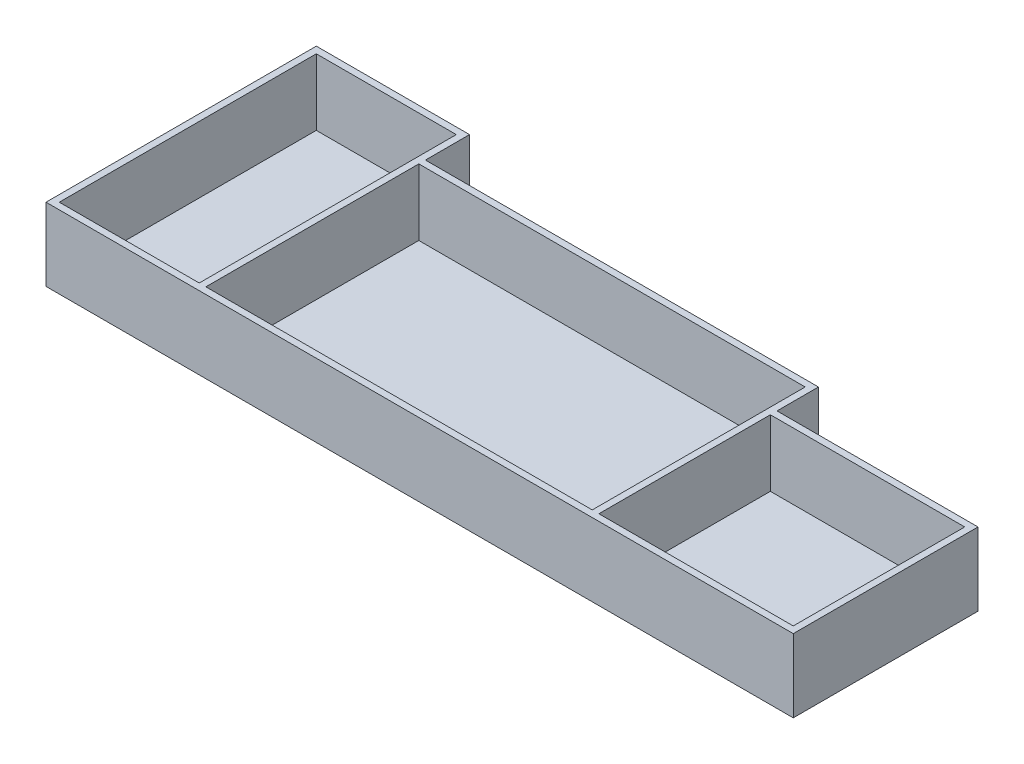
ISO-10303-21;
HEADER;
FILE_DESCRIPTION(('STEP AP214'),'2;1');
FILE_NAME('part.step','',(''),(''),'','','');
FILE_SCHEMA(('AUTOMOTIVE_DESIGN { 1 0 10303 214 1 1 1 1 }'));
ENDSEC;
DATA;
#1=APPLICATION_CONTEXT('core data for automotive mechanical design processes');
#2=APPLICATION_PROTOCOL_DEFINITION('international standard','automotive_design',2000,#1);
#3=PRODUCT_CONTEXT('',#1,'mechanical');
#4=PRODUCT('Part','Part','',(#3));
#5=PRODUCT_RELATED_PRODUCT_CATEGORY('part','',(#4));
#6=PRODUCT_DEFINITION_FORMATION('','',#4);
#7=PRODUCT_DEFINITION_CONTEXT('part definition',#1,'design');
#8=PRODUCT_DEFINITION('design','',#6,#7);
#9=PRODUCT_DEFINITION_SHAPE('','',#8);
#10=(LENGTH_UNIT() NAMED_UNIT(*) SI_UNIT(.MILLI.,.METRE.));
#11=(NAMED_UNIT(*) PLANE_ANGLE_UNIT() SI_UNIT($,.RADIAN.));
#12=(NAMED_UNIT(*) SI_UNIT($,.STERADIAN.) SOLID_ANGLE_UNIT());
#13=UNCERTAINTY_MEASURE_WITH_UNIT(LENGTH_MEASURE(1.E-05),#10,'distance_accuracy_value','');
#14=(GEOMETRIC_REPRESENTATION_CONTEXT(3) GLOBAL_UNCERTAINTY_ASSIGNED_CONTEXT((#13)) GLOBAL_UNIT_ASSIGNED_CONTEXT((#10,
#11,#12)) REPRESENTATION_CONTEXT('',''));
#15=CARTESIAN_POINT('',(0.,0.,0.));
#16=DIRECTION('',(0.,0.,1.));
#17=DIRECTION('',(1.,0.,0.));
#18=AXIS2_PLACEMENT_3D('',#15,#16,#17);
#19=CARTESIAN_POINT('',(0.,-2.,0.));
#20=DIRECTION('',(1.,0.,0.));
#21=DIRECTION('',(0.,0.,-1.));
#22=AXIS2_PLACEMENT_3D('',#19,#20,#21);
#23=PLANE('',#22);
#24=DIRECTION('',(0.,1.,0.));
#25=VECTOR('',#24,1.);
#26=CARTESIAN_POINT('',(0.,-2.,0.));
#27=LINE('',#26,#25);
#28=CARTESIAN_POINT('',(0.,-2.,0.));
#29=VERTEX_POINT('',#28);
#30=CARTESIAN_POINT('',(0.,20.,0.));
#31=VERTEX_POINT('',#30);
#32=EDGE_CURVE('E38',#29,#31,#27,.T.);
#33=ORIENTED_EDGE('',*,*,#32,.T.);
#34=DIRECTION('',(0.,0.,-1.));
#35=VECTOR('',#34,1.);
#36=CARTESIAN_POINT('',(0.,20.,0.));
#37=LINE('',#36,#35);
#38=CARTESIAN_POINT('',(0.,20.,-81.5));
#39=VERTEX_POINT('',#38);
#40=EDGE_CURVE('E175',#31,#39,#37,.T.);
#41=ORIENTED_EDGE('',*,*,#40,.T.);
#42=DIRECTION('',(0.,1.,0.));
#43=VECTOR('',#42,1.);
#44=CARTESIAN_POINT('',(0.,-2.,-81.5));
#45=LINE('',#44,#43);
#46=CARTESIAN_POINT('',(0.,-2.,-81.5));
#47=VERTEX_POINT('',#46);
#48=EDGE_CURVE('E11',#47,#39,#45,.T.);
#49=ORIENTED_EDGE('',*,*,#48,.F.);
#50=DIRECTION('',(0.,0.,-1.));
#51=VECTOR('',#50,1.);
#52=CARTESIAN_POINT('',(0.,-2.,0.));
#53=LINE('',#52,#51);
#54=EDGE_CURVE('E178',#29,#47,#53,.T.);
#55=ORIENTED_EDGE('',*,*,#54,.F.);
#56=EDGE_LOOP('',(#33,#41,#49,#55));
#57=FACE_BOUND('',#56,.T.);
#58=ADVANCED_FACE('F35',(#57),#23,.F.);
#59=CARTESIAN_POINT('',(0.,-2.,-81.5));
#60=DIRECTION('',(0.,0.,1.));
#61=DIRECTION('',(1.,0.,0.));
#62=AXIS2_PLACEMENT_3D('',#59,#60,#61);
#63=PLANE('',#62);
#64=ORIENTED_EDGE('',*,*,#48,.T.);
#65=DIRECTION('',(1.,0.,0.));
#66=VECTOR('',#65,1.);
#67=CARTESIAN_POINT('',(0.,20.,-81.5));
#68=LINE('',#67,#66);
#69=CARTESIAN_POINT('',(46.2,20.,-81.5));
#70=VERTEX_POINT('',#69);
#71=EDGE_CURVE('E197',#39,#70,#68,.T.);
#72=ORIENTED_EDGE('',*,*,#71,.T.);
#73=DIRECTION('',(0.,1.,0.));
#74=VECTOR('',#73,1.);
#75=CARTESIAN_POINT('',(46.2,-2.,-81.5));
#76=LINE('',#75,#74);
#77=CARTESIAN_POINT('',(46.2,-2.,-81.5));
#78=VERTEX_POINT('',#77);
#79=EDGE_CURVE('E43',#78,#70,#76,.T.);
#80=ORIENTED_EDGE('',*,*,#79,.F.);
#81=DIRECTION('',(1.,0.,0.));
#82=VECTOR('',#81,1.);
#83=CARTESIAN_POINT('',(0.,-2.,-81.5));
#84=LINE('',#83,#82);
#85=EDGE_CURVE('E183',#47,#78,#84,.T.);
#86=ORIENTED_EDGE('',*,*,#85,.F.);
#87=EDGE_LOOP('',(#64,#72,#80,#86));
#88=FACE_BOUND('',#87,.T.);
#89=ADVANCED_FACE('F348',(#88),#63,.F.);
#90=CARTESIAN_POINT('',(46.2,-2.,0.));
#91=DIRECTION('',(-1.,0.,0.));
#92=DIRECTION('',(0.,0.,1.));
#93=AXIS2_PLACEMENT_3D('',#90,#91,#92);
#94=PLANE('',#93);
#95=ORIENTED_EDGE('',*,*,#79,.T.);
#96=DIRECTION('',(0.,0.,1.));
#97=VECTOR('',#96,1.);
#98=CARTESIAN_POINT('',(46.2,20.,0.));
#99=LINE('',#98,#97);
#100=CARTESIAN_POINT('',(46.2,20.,-68.2));
#101=VERTEX_POINT('',#100);
#102=EDGE_CURVE('E213',#70,#101,#99,.T.);
#103=ORIENTED_EDGE('',*,*,#102,.T.);
#104=DIRECTION('',(0.,1.,0.));
#105=VECTOR('',#104,1.);
#106=CARTESIAN_POINT('',(46.2,-2.,-68.2));
#107=LINE('',#106,#105);
#108=CARTESIAN_POINT('',(46.2,-2.,-68.2));
#109=VERTEX_POINT('',#108);
#110=EDGE_CURVE('E317',#109,#101,#107,.T.);
#111=ORIENTED_EDGE('',*,*,#110,.F.);
#112=DIRECTION('',(0.,0.,1.));
#113=VECTOR('',#112,1.);
#114=CARTESIAN_POINT('',(46.2,-2.,0.));
#115=LINE('',#114,#113);
#116=EDGE_CURVE('E313',#78,#109,#115,.T.);
#117=ORIENTED_EDGE('',*,*,#116,.F.);
#118=EDGE_LOOP('',(#95,#103,#111,#117));
#119=FACE_BOUND('',#118,.T.);
#120=ADVANCED_FACE('F345',(#119),#94,.F.);
#121=CARTESIAN_POINT('',(0.,-2.,-68.2));
#122=DIRECTION('',(0.,0.,1.));
#123=DIRECTION('',(1.,0.,0.));
#124=AXIS2_PLACEMENT_3D('',#121,#122,#123);
#125=PLANE('',#124);
#126=ORIENTED_EDGE('',*,*,#110,.T.);
#127=DIRECTION('',(1.,0.,0.));
#128=VECTOR('',#127,1.);
#129=CARTESIAN_POINT('',(0.,20.,-68.2));
#130=LINE('',#129,#128);
#131=CARTESIAN_POINT('',(164.7,20.,-68.2));
#132=VERTEX_POINT('',#131);
#133=EDGE_CURVE('E210',#101,#132,#130,.T.);
#134=ORIENTED_EDGE('',*,*,#133,.T.);
#135=DIRECTION('',(0.,1.,0.));
#136=VECTOR('',#135,1.);
#137=CARTESIAN_POINT('',(164.7,-2.,-68.2));
#138=LINE('',#137,#136);
#139=CARTESIAN_POINT('',(164.7,-2.,-68.2));
#140=VERTEX_POINT('',#139);
#141=EDGE_CURVE('E319',#140,#132,#138,.T.);
#142=ORIENTED_EDGE('',*,*,#141,.F.);
#143=DIRECTION('',(1.,0.,0.));
#144=VECTOR('',#143,1.);
#145=CARTESIAN_POINT('',(0.,-2.,-68.2));
#146=LINE('',#145,#144);
#147=EDGE_CURVE('E311',#109,#140,#146,.T.);
#148=ORIENTED_EDGE('',*,*,#147,.F.);
#149=EDGE_LOOP('',(#126,#134,#142,#148));
#150=FACE_BOUND('',#149,.T.);
#151=ADVANCED_FACE('F340',(#150),#125,.F.);
#152=CARTESIAN_POINT('',(164.7,-2.,0.));
#153=DIRECTION('',(-1.,0.,0.));
#154=DIRECTION('',(0.,0.,1.));
#155=AXIS2_PLACEMENT_3D('',#152,#153,#154);
#156=PLANE('',#155);
#157=ORIENTED_EDGE('',*,*,#141,.T.);
#158=DIRECTION('',(0.,0.,1.));
#159=VECTOR('',#158,1.);
#160=CARTESIAN_POINT('',(164.7,20.,0.));
#161=LINE('',#160,#159);
#162=CARTESIAN_POINT('',(164.7,20.,-55.7));
#163=VERTEX_POINT('',#162);
#164=EDGE_CURVE('E207',#132,#163,#161,.T.);
#165=ORIENTED_EDGE('',*,*,#164,.T.);
#166=DIRECTION('',(0.,1.,0.));
#167=VECTOR('',#166,1.);
#168=CARTESIAN_POINT('',(164.7,-2.,-55.7));
#169=LINE('',#168,#167);
#170=CARTESIAN_POINT('',(164.7,-2.,-55.7));
#171=VERTEX_POINT('',#170);
#172=EDGE_CURVE('E321',#171,#163,#169,.T.);
#173=ORIENTED_EDGE('',*,*,#172,.F.);
#174=DIRECTION('',(0.,0.,1.));
#175=VECTOR('',#174,1.);
#176=CARTESIAN_POINT('',(164.7,-2.,0.));
#177=LINE('',#176,#175);
#178=EDGE_CURVE('E309',#140,#171,#177,.T.);
#179=ORIENTED_EDGE('',*,*,#178,.F.);
#180=EDGE_LOOP('',(#157,#165,#173,#179));
#181=FACE_BOUND('',#180,.T.);
#182=ADVANCED_FACE('F336',(#181),#156,.F.);
#183=CARTESIAN_POINT('',(0.,-2.,-55.7));
#184=DIRECTION('',(0.,0.,1.));
#185=DIRECTION('',(1.,0.,0.));
#186=AXIS2_PLACEMENT_3D('',#183,#184,#185);
#187=PLANE('',#186);
#188=ORIENTED_EDGE('',*,*,#172,.T.);
#189=DIRECTION('',(1.,0.,0.));
#190=VECTOR('',#189,1.);
#191=CARTESIAN_POINT('',(0.,20.,-55.7));
#192=LINE('',#191,#190);
#193=CARTESIAN_POINT('',(225.3,20.,-55.7));
#194=VERTEX_POINT('',#193);
#195=EDGE_CURVE('E204',#163,#194,#192,.T.);
#196=ORIENTED_EDGE('',*,*,#195,.T.);
#197=DIRECTION('',(0.,1.,0.));
#198=VECTOR('',#197,1.);
#199=CARTESIAN_POINT('',(225.3,-2.,-55.7));
#200=LINE('',#199,#198);
#201=CARTESIAN_POINT('',(225.3,-2.,-55.7));
#202=VERTEX_POINT('',#201);
#203=EDGE_CURVE('E323',#202,#194,#200,.T.);
#204=ORIENTED_EDGE('',*,*,#203,.F.);
#205=DIRECTION('',(1.,0.,0.));
#206=VECTOR('',#205,1.);
#207=CARTESIAN_POINT('',(0.,-2.,-55.7));
#208=LINE('',#207,#206);
#209=EDGE_CURVE('E307',#171,#202,#208,.T.);
#210=ORIENTED_EDGE('',*,*,#209,.F.);
#211=EDGE_LOOP('',(#188,#196,#204,#210));
#212=FACE_BOUND('',#211,.T.);
#213=ADVANCED_FACE('F332',(#212),#187,.F.);
#214=CARTESIAN_POINT('',(225.3,-2.,0.));
#215=DIRECTION('',(-1.,0.,0.));
#216=DIRECTION('',(0.,0.,1.));
#217=AXIS2_PLACEMENT_3D('',#214,#215,#216);
#218=PLANE('',#217);
#219=ORIENTED_EDGE('',*,*,#203,.T.);
#220=DIRECTION('',(0.,0.,1.));
#221=VECTOR('',#220,1.);
#222=CARTESIAN_POINT('',(225.3,20.,0.));
#223=LINE('',#222,#221);
#224=CARTESIAN_POINT('',(225.3,20.,0.));
#225=VERTEX_POINT('',#224);
#226=EDGE_CURVE('E191',#194,#225,#223,.T.);
#227=ORIENTED_EDGE('',*,*,#226,.T.);
#228=DIRECTION('',(0.,1.,0.));
#229=VECTOR('',#228,1.);
#230=CARTESIAN_POINT('',(225.3,-2.,0.));
#231=LINE('',#230,#229);
#232=CARTESIAN_POINT('',(225.3,-2.,0.));
#233=VERTEX_POINT('',#232);
#234=EDGE_CURVE('E182',#233,#225,#231,.T.);
#235=ORIENTED_EDGE('',*,*,#234,.F.);
#236=DIRECTION('',(0.,0.,1.));
#237=VECTOR('',#236,1.);
#238=CARTESIAN_POINT('',(225.3,-2.,0.));
#239=LINE('',#238,#237);
#240=EDGE_CURVE('E305',#202,#233,#239,.T.);
#241=ORIENTED_EDGE('',*,*,#240,.F.);
#242=EDGE_LOOP('',(#219,#227,#235,#241));
#243=FACE_BOUND('',#242,.T.);
#244=ADVANCED_FACE('F327',(#243),#218,.F.);
#245=CARTESIAN_POINT('',(0.,-2.,0.));
#246=DIRECTION('',(0.,0.,1.));
#247=DIRECTION('',(1.,0.,0.));
#248=AXIS2_PLACEMENT_3D('',#245,#246,#247);
#249=PLANE('',#248);
#250=ORIENTED_EDGE('',*,*,#234,.T.);
#251=DIRECTION('',(1.,0.,0.));
#252=VECTOR('',#251,1.);
#253=CARTESIAN_POINT('',(0.,20.,0.));
#254=LINE('',#253,#252);
#255=EDGE_CURVE('E185',#31,#225,#254,.T.);
#256=ORIENTED_EDGE('',*,*,#255,.F.);
#257=ORIENTED_EDGE('',*,*,#32,.F.);
#258=DIRECTION('',(1.,0.,0.));
#259=VECTOR('',#258,1.);
#260=CARTESIAN_POINT('',(0.,-2.,0.));
#261=LINE('',#260,#259);
#262=EDGE_CURVE('E303',#29,#233,#261,.T.);
#263=ORIENTED_EDGE('',*,*,#262,.T.);
#264=EDGE_LOOP('',(#250,#256,#257,#263));
#265=FACE_BOUND('',#264,.T.);
#266=ADVANCED_FACE('F186',(#265),#249,.T.);
#267=CARTESIAN_POINT('',(0.,-2.,0.));
#268=DIRECTION('',(0.,1.,0.));
#269=DIRECTION('',(0.,0.,1.));
#270=AXIS2_PLACEMENT_3D('',#267,#268,#269);
#271=PLANE('',#270);
#272=ORIENTED_EDGE('',*,*,#54,.T.);
#273=ORIENTED_EDGE('',*,*,#85,.T.);
#274=ORIENTED_EDGE('',*,*,#116,.T.);
#275=ORIENTED_EDGE('',*,*,#147,.T.);
#276=ORIENTED_EDGE('',*,*,#178,.T.);
#277=ORIENTED_EDGE('',*,*,#209,.T.);
#278=ORIENTED_EDGE('',*,*,#240,.T.);
#279=ORIENTED_EDGE('',*,*,#262,.F.);
#280=EDGE_LOOP('',(#272,#273,#274,#275,#276,#277,#278,#279));
#281=FACE_BOUND('',#280,.T.);
#282=ADVANCED_FACE('F350',(#281),#271,.F.);
#283=CARTESIAN_POINT('',(0.,20.,-66.2));
#284=DIRECTION('',(0.,0.,-1.));
#285=DIRECTION('',(-1.,0.,0.));
#286=AXIS2_PLACEMENT_3D('',#283,#284,#285);
#287=PLANE('',#286);
#288=DIRECTION('',(1.,0.,0.));
#289=VECTOR('',#288,1.);
#290=CARTESIAN_POINT('',(0.,0.,-66.2));
#291=LINE('',#290,#289);
#292=CARTESIAN_POINT('',(46.2,0.,-66.2));
#293=VERTEX_POINT('',#292);
#294=CARTESIAN_POINT('',(162.7,0.,-66.2));
#295=VERTEX_POINT('',#294);
#296=EDGE_CURVE('E268',#293,#295,#291,.T.);
#297=ORIENTED_EDGE('',*,*,#296,.T.);
#298=DIRECTION('',(0.,-1.,0.));
#299=VECTOR('',#298,1.);
#300=CARTESIAN_POINT('',(162.7,20.,-66.2));
#301=LINE('',#300,#299);
#302=CARTESIAN_POINT('',(162.7,20.,-66.2));
#303=VERTEX_POINT('',#302);
#304=EDGE_CURVE('E285',#303,#295,#301,.T.);
#305=ORIENTED_EDGE('',*,*,#304,.F.);
#306=DIRECTION('',(1.,0.,0.));
#307=VECTOR('',#306,1.);
#308=CARTESIAN_POINT('',(0.,20.,-66.2));
#309=LINE('',#308,#307);
#310=CARTESIAN_POINT('',(46.2,20.,-66.2));
#311=VERTEX_POINT('',#310);
#312=EDGE_CURVE('E238',#311,#303,#309,.T.);
#313=ORIENTED_EDGE('',*,*,#312,.F.);
#314=DIRECTION('',(0.,-1.,0.));
#315=VECTOR('',#314,1.);
#316=CARTESIAN_POINT('',(46.2,20.,-66.2));
#317=LINE('',#316,#315);
#318=EDGE_CURVE('E276',#311,#293,#317,.T.);
#319=ORIENTED_EDGE('',*,*,#318,.T.);
#320=EDGE_LOOP('',(#297,#305,#313,#319));
#321=FACE_BOUND('',#320,.T.);
#322=ADVANCED_FACE('F352',(#321),#287,.F.);
#323=CARTESIAN_POINT('',(162.7,20.,0.));
#324=DIRECTION('',(1.,0.,0.));
#325=DIRECTION('',(0.,0.,-1.));
#326=AXIS2_PLACEMENT_3D('',#323,#324,#325);
#327=PLANE('',#326);
#328=DIRECTION('',(0.,0.,1.));
#329=VECTOR('',#328,1.);
#330=CARTESIAN_POINT('',(162.7,0.,0.));
#331=LINE('',#330,#329);
#332=CARTESIAN_POINT('',(162.7,0.,-2.00000000000005));
#333=VERTEX_POINT('',#332);
#334=EDGE_CURVE('E271',#295,#333,#331,.T.);
#335=ORIENTED_EDGE('',*,*,#334,.T.);
#336=DIRECTION('',(0.,-1.,0.));
#337=VECTOR('',#336,1.);
#338=CARTESIAN_POINT('',(162.7,20.,-2.00000000000005));
#339=LINE('',#338,#337);
#340=CARTESIAN_POINT('',(162.7,20.,-2.00000000000005));
#341=VERTEX_POINT('',#340);
#342=EDGE_CURVE('E283',#341,#333,#339,.T.);
#343=ORIENTED_EDGE('',*,*,#342,.F.);
#344=DIRECTION('',(0.,0.,1.));
#345=VECTOR('',#344,1.);
#346=CARTESIAN_POINT('',(162.7,20.,0.));
#347=LINE('',#346,#345);
#348=EDGE_CURVE('E241',#303,#341,#347,.T.);
#349=ORIENTED_EDGE('',*,*,#348,.F.);
#350=ORIENTED_EDGE('',*,*,#304,.T.);
#351=EDGE_LOOP('',(#335,#343,#349,#350));
#352=FACE_BOUND('',#351,.T.);
#353=ADVANCED_FACE('F358',(#352),#327,.F.);
#354=CARTESIAN_POINT('',(0.,20.,-1.99999999999998));
#355=DIRECTION('',(0.,0.,-1.));
#356=DIRECTION('',(-1.,0.,0.));
#357=AXIS2_PLACEMENT_3D('',#354,#355,#356);
#358=PLANE('',#357);
#359=DIRECTION('',(1.,0.,0.));
#360=VECTOR('',#359,1.);
#361=CARTESIAN_POINT('',(0.,0.,-1.99999999999998));
#362=LINE('',#361,#360);
#363=CARTESIAN_POINT('',(46.2,0.,-2.));
#364=VERTEX_POINT('',#363);
#365=EDGE_CURVE('E200',#364,#333,#362,.T.);
#366=ORIENTED_EDGE('',*,*,#365,.F.);
#367=DIRECTION('',(0.,-1.,0.));
#368=VECTOR('',#367,1.);
#369=CARTESIAN_POINT('',(46.2,20.,-2.));
#370=LINE('',#369,#368);
#371=CARTESIAN_POINT('',(46.2,20.,-2.));
#372=VERTEX_POINT('',#371);
#373=EDGE_CURVE('E279',#372,#364,#370,.T.);
#374=ORIENTED_EDGE('',*,*,#373,.F.);
#375=DIRECTION('',(1.,0.,0.));
#376=VECTOR('',#375,1.);
#377=CARTESIAN_POINT('',(0.,20.,-1.99999999999998));
#378=LINE('',#377,#376);
#379=EDGE_CURVE('E243',#372,#341,#378,.T.);
#380=ORIENTED_EDGE('',*,*,#379,.T.);
#381=ORIENTED_EDGE('',*,*,#342,.T.);
#382=EDGE_LOOP('',(#366,#374,#380,#381));
#383=FACE_BOUND('',#382,.T.);
#384=ADVANCED_FACE('F406',(#383),#358,.T.);
#385=CARTESIAN_POINT('',(0.,20.,-79.5));
#386=DIRECTION('',(0.,0.,-1.));
#387=DIRECTION('',(-1.,0.,0.));
#388=AXIS2_PLACEMENT_3D('',#385,#386,#387);
#389=PLANE('',#388);
#390=DIRECTION('',(1.,0.,0.));
#391=VECTOR('',#390,1.);
#392=CARTESIAN_POINT('',(0.,0.,-79.5));
#393=LINE('',#392,#391);
#394=CARTESIAN_POINT('',(2.,0.,-79.5));
#395=VERTEX_POINT('',#394);
#396=CARTESIAN_POINT('',(44.2,0.,-79.5));
#397=VERTEX_POINT('',#396);
#398=EDGE_CURVE('E259',#395,#397,#393,.T.);
#399=ORIENTED_EDGE('',*,*,#398,.T.);
#400=DIRECTION('',(0.,-1.,0.));
#401=VECTOR('',#400,1.);
#402=CARTESIAN_POINT('',(44.2,20.,-79.5));
#403=LINE('',#402,#401);
#404=CARTESIAN_POINT('',(44.2,20.,-79.5));
#405=VERTEX_POINT('',#404);
#406=EDGE_CURVE('E280',#405,#397,#403,.T.);
#407=ORIENTED_EDGE('',*,*,#406,.F.);
#408=DIRECTION('',(1.,0.,0.));
#409=VECTOR('',#408,1.);
#410=CARTESIAN_POINT('',(0.,20.,-79.5));
#411=LINE('',#410,#409);
#412=CARTESIAN_POINT('',(2.,20.,-79.5));
#413=VERTEX_POINT('',#412);
#414=EDGE_CURVE('E228',#413,#405,#411,.T.);
#415=ORIENTED_EDGE('',*,*,#414,.F.);
#416=DIRECTION('',(0.,-1.,0.));
#417=VECTOR('',#416,1.);
#418=CARTESIAN_POINT('',(2.,20.,-79.5));
#419=LINE('',#418,#417);
#420=EDGE_CURVE('E287',#413,#395,#419,.T.);
#421=ORIENTED_EDGE('',*,*,#420,.T.);
#422=EDGE_LOOP('',(#399,#407,#415,#421));
#423=FACE_BOUND('',#422,.T.);
#424=ADVANCED_FACE('F417',(#423),#389,.F.);
#425=CARTESIAN_POINT('',(44.2,20.,0.));
#426=DIRECTION('',(1.,0.,0.));
#427=DIRECTION('',(0.,0.,-1.));
#428=AXIS2_PLACEMENT_3D('',#425,#426,#427);
#429=PLANE('',#428);
#430=DIRECTION('',(0.,0.,1.));
#431=VECTOR('',#430,1.);
#432=CARTESIAN_POINT('',(44.2,0.,0.));
#433=LINE('',#432,#431);
#434=CARTESIAN_POINT('',(44.2,0.,-2.00000000000001));
#435=VERTEX_POINT('',#434);
#436=EDGE_CURVE('E262',#397,#435,#433,.T.);
#437=ORIENTED_EDGE('',*,*,#436,.T.);
#438=DIRECTION('',(0.,-1.,0.));
#439=VECTOR('',#438,1.);
#440=CARTESIAN_POINT('',(44.2,20.,-2.00000000000001));
#441=LINE('',#440,#439);
#442=CARTESIAN_POINT('',(44.2,20.,-2.00000000000001));
#443=VERTEX_POINT('',#442);
#444=EDGE_CURVE('E293',#443,#435,#441,.T.);
#445=ORIENTED_EDGE('',*,*,#444,.F.);
#446=DIRECTION('',(0.,0.,1.));
#447=VECTOR('',#446,1.);
#448=CARTESIAN_POINT('',(44.2,20.,0.));
#449=LINE('',#448,#447);
#450=EDGE_CURVE('E231',#405,#443,#449,.T.);
#451=ORIENTED_EDGE('',*,*,#450,.F.);
#452=ORIENTED_EDGE('',*,*,#406,.T.);
#453=EDGE_LOOP('',(#437,#445,#451,#452));
#454=FACE_BOUND('',#453,.T.);
#455=ADVANCED_FACE('F427',(#454),#429,.F.);
#456=CARTESIAN_POINT('',(0.,20.,-2.));
#457=DIRECTION('',(0.,0.,-1.));
#458=DIRECTION('',(-1.,0.,0.));
#459=AXIS2_PLACEMENT_3D('',#456,#457,#458);
#460=PLANE('',#459);
#461=DIRECTION('',(1.,0.,0.));
#462=VECTOR('',#461,1.);
#463=CARTESIAN_POINT('',(0.,0.,-2.));
#464=LINE('',#463,#462);
#465=CARTESIAN_POINT('',(2.,0.,-2.));
#466=VERTEX_POINT('',#465);
#467=EDGE_CURVE('E51',#466,#435,#464,.T.);
#468=ORIENTED_EDGE('',*,*,#467,.F.);
#469=DIRECTION('',(0.,-1.,0.));
#470=VECTOR('',#469,1.);
#471=CARTESIAN_POINT('',(2.,20.,-2.));
#472=LINE('',#471,#470);
#473=CARTESIAN_POINT('',(2.,20.,-2.));
#474=VERTEX_POINT('',#473);
#475=EDGE_CURVE('E290',#474,#466,#472,.T.);
#476=ORIENTED_EDGE('',*,*,#475,.F.);
#477=DIRECTION('',(1.,0.,0.));
#478=VECTOR('',#477,1.);
#479=CARTESIAN_POINT('',(0.,20.,-2.));
#480=LINE('',#479,#478);
#481=EDGE_CURVE('E233',#474,#443,#480,.T.);
#482=ORIENTED_EDGE('',*,*,#481,.T.);
#483=ORIENTED_EDGE('',*,*,#444,.T.);
#484=EDGE_LOOP('',(#468,#476,#482,#483));
#485=FACE_BOUND('',#484,.T.);
#486=ADVANCED_FACE('F438',(#485),#460,.T.);
#487=CARTESIAN_POINT('',(0.,20.,-53.7));
#488=DIRECTION('',(0.,0.,1.));
#489=DIRECTION('',(1.,0.,0.));
#490=AXIS2_PLACEMENT_3D('',#487,#488,#489);
#491=PLANE('',#490);
#492=DIRECTION('',(-1.,0.,0.));
#493=VECTOR('',#492,1.);
#494=CARTESIAN_POINT('',(0.,0.,-53.7));
#495=LINE('',#494,#493);
#496=CARTESIAN_POINT('',(223.3,0.,-53.7));
#497=VERTEX_POINT('',#496);
#498=CARTESIAN_POINT('',(164.7,0.,-53.7));
#499=VERTEX_POINT('',#498);
#500=EDGE_CURVE('E249',#497,#499,#495,.T.);
#501=ORIENTED_EDGE('',*,*,#500,.F.);
#502=DIRECTION('',(0.,-1.,0.));
#503=VECTOR('',#502,1.);
#504=CARTESIAN_POINT('',(223.3,20.,-53.7));
#505=LINE('',#504,#503);
#506=CARTESIAN_POINT('',(223.3,20.,-53.7));
#507=VERTEX_POINT('',#506);
#508=EDGE_CURVE('E291',#507,#497,#505,.T.);
#509=ORIENTED_EDGE('',*,*,#508,.F.);
#510=DIRECTION('',(-1.,0.,0.));
#511=VECTOR('',#510,1.);
#512=CARTESIAN_POINT('',(0.,20.,-53.7));
#513=LINE('',#512,#511);
#514=CARTESIAN_POINT('',(164.7,20.,-53.7));
#515=VERTEX_POINT('',#514);
#516=EDGE_CURVE('E217',#507,#515,#513,.T.);
#517=ORIENTED_EDGE('',*,*,#516,.T.);
#518=DIRECTION('',(0.,-1.,0.));
#519=VECTOR('',#518,1.);
#520=CARTESIAN_POINT('',(164.7,20.,-53.7));
#521=LINE('',#520,#519);
#522=EDGE_CURVE('E248',#515,#499,#521,.T.);
#523=ORIENTED_EDGE('',*,*,#522,.T.);
#524=EDGE_LOOP('',(#501,#509,#517,#523));
#525=FACE_BOUND('',#524,.T.);
#526=ADVANCED_FACE('F449',(#525),#491,.T.);
#527=CARTESIAN_POINT('',(223.3,20.,0.));
#528=DIRECTION('',(-1.,0.,0.));
#529=DIRECTION('',(0.,0.,1.));
#530=AXIS2_PLACEMENT_3D('',#527,#528,#529);
#531=PLANE('',#530);
#532=DIRECTION('',(0.,0.,-1.));
#533=VECTOR('',#532,1.);
#534=CARTESIAN_POINT('',(223.3,0.,0.));
#535=LINE('',#534,#533);
#536=CARTESIAN_POINT('',(223.3,0.,-2.00000000000008));
#537=VERTEX_POINT('',#536);
#538=EDGE_CURVE('E252',#537,#497,#535,.T.);
#539=ORIENTED_EDGE('',*,*,#538,.F.);
#540=DIRECTION('',(0.,-1.,0.));
#541=VECTOR('',#540,1.);
#542=CARTESIAN_POINT('',(223.3,20.,-2.00000000000008));
#543=LINE('',#542,#541);
#544=CARTESIAN_POINT('',(223.3,20.,-2.00000000000008));
#545=VERTEX_POINT('',#544);
#546=EDGE_CURVE('E299',#545,#537,#543,.T.);
#547=ORIENTED_EDGE('',*,*,#546,.F.);
#548=DIRECTION('',(0.,0.,-1.));
#549=VECTOR('',#548,1.);
#550=CARTESIAN_POINT('',(223.3,20.,0.));
#551=LINE('',#550,#549);
#552=EDGE_CURVE('E220',#545,#507,#551,.T.);
#553=ORIENTED_EDGE('',*,*,#552,.T.);
#554=ORIENTED_EDGE('',*,*,#508,.T.);
#555=EDGE_LOOP('',(#539,#547,#553,#554));
#556=FACE_BOUND('',#555,.T.);
#557=ADVANCED_FACE('F458',(#556),#531,.T.);
#558=CARTESIAN_POINT('',(0.,20.,-1.99999999999979));
#559=DIRECTION('',(0.,0.,-1.));
#560=DIRECTION('',(-1.,0.,0.));
#561=AXIS2_PLACEMENT_3D('',#558,#559,#560);
#562=PLANE('',#561);
#563=DIRECTION('',(1.,0.,0.));
#564=VECTOR('',#563,1.);
#565=CARTESIAN_POINT('',(0.,0.,-1.99999999999979));
#566=LINE('',#565,#564);
#567=CARTESIAN_POINT('',(164.7,0.,-2.));
#568=VERTEX_POINT('',#567);
#569=EDGE_CURVE('E59',#568,#537,#566,.T.);
#570=ORIENTED_EDGE('',*,*,#569,.F.);
#571=DIRECTION('',(0.,-1.,0.));
#572=VECTOR('',#571,1.);
#573=CARTESIAN_POINT('',(164.7,20.,-2.));
#574=LINE('',#573,#572);
#575=CARTESIAN_POINT('',(164.7,20.,-2.));
#576=VERTEX_POINT('',#575);
#577=EDGE_CURVE('E297',#576,#568,#574,.T.);
#578=ORIENTED_EDGE('',*,*,#577,.F.);
#579=DIRECTION('',(1.,0.,0.));
#580=VECTOR('',#579,1.);
#581=CARTESIAN_POINT('',(0.,20.,-1.99999999999979));
#582=LINE('',#581,#580);
#583=EDGE_CURVE('E223',#576,#545,#582,.T.);
#584=ORIENTED_EDGE('',*,*,#583,.T.);
#585=ORIENTED_EDGE('',*,*,#546,.T.);
#586=EDGE_LOOP('',(#570,#578,#584,#585));
#587=FACE_BOUND('',#586,.T.);
#588=ADVANCED_FACE('F467',(#587),#562,.T.);
#589=CARTESIAN_POINT('',(2.,20.,0.));
#590=DIRECTION('',(-1.,0.,0.));
#591=DIRECTION('',(0.,0.,1.));
#592=AXIS2_PLACEMENT_3D('',#589,#590,#591);
#593=PLANE('',#592);
#594=DIRECTION('',(0.,0.,-1.));
#595=VECTOR('',#594,1.);
#596=CARTESIAN_POINT('',(2.,0.,0.));
#597=LINE('',#596,#595);
#598=EDGE_CURVE('E266',#466,#395,#597,.T.);
#599=ORIENTED_EDGE('',*,*,#598,.T.);
#600=ORIENTED_EDGE('',*,*,#420,.F.);
#601=DIRECTION('',(0.,0.,-1.));
#602=VECTOR('',#601,1.);
#603=CARTESIAN_POINT('',(2.,20.,0.));
#604=LINE('',#603,#602);
#605=EDGE_CURVE('E236',#474,#413,#604,.T.);
#606=ORIENTED_EDGE('',*,*,#605,.F.);
#607=ORIENTED_EDGE('',*,*,#475,.T.);
#608=EDGE_LOOP('',(#599,#600,#606,#607));
#609=FACE_BOUND('',#608,.T.);
#610=ADVANCED_FACE('F477',(#609),#593,.F.);
#611=CARTESIAN_POINT('',(164.7,20.,0.));
#612=DIRECTION('',(-1.,0.,0.));
#613=DIRECTION('',(0.,0.,1.));
#614=AXIS2_PLACEMENT_3D('',#611,#612,#613);
#615=PLANE('',#614);
#616=DIRECTION('',(0.,0.,-1.));
#617=VECTOR('',#616,1.);
#618=CARTESIAN_POINT('',(164.7,0.,0.));
#619=LINE('',#618,#617);
#620=EDGE_CURVE('E256',#568,#499,#619,.T.);
#621=ORIENTED_EDGE('',*,*,#620,.T.);
#622=ORIENTED_EDGE('',*,*,#522,.F.);
#623=DIRECTION('',(0.,0.,-1.));
#624=VECTOR('',#623,1.);
#625=CARTESIAN_POINT('',(164.7,20.,0.));
#626=LINE('',#625,#624);
#627=EDGE_CURVE('E226',#576,#515,#626,.T.);
#628=ORIENTED_EDGE('',*,*,#627,.F.);
#629=ORIENTED_EDGE('',*,*,#577,.T.);
#630=EDGE_LOOP('',(#621,#622,#628,#629));
#631=FACE_BOUND('',#630,.T.);
#632=ADVANCED_FACE('F486',(#631),#615,.F.);
#633=CARTESIAN_POINT('',(46.2,20.,0.));
#634=DIRECTION('',(-1.,0.,0.));
#635=DIRECTION('',(0.,0.,1.));
#636=AXIS2_PLACEMENT_3D('',#633,#634,#635);
#637=PLANE('',#636);
#638=DIRECTION('',(0.,0.,-1.));
#639=VECTOR('',#638,1.);
#640=CARTESIAN_POINT('',(46.2,0.,0.));
#641=LINE('',#640,#639);
#642=EDGE_CURVE('E198',#364,#293,#641,.T.);
#643=ORIENTED_EDGE('',*,*,#642,.T.);
#644=ORIENTED_EDGE('',*,*,#318,.F.);
#645=DIRECTION('',(0.,0.,-1.));
#646=VECTOR('',#645,1.);
#647=CARTESIAN_POINT('',(46.2,20.,0.));
#648=LINE('',#647,#646);
#649=EDGE_CURVE('E246',#372,#311,#648,.T.);
#650=ORIENTED_EDGE('',*,*,#649,.F.);
#651=ORIENTED_EDGE('',*,*,#373,.T.);
#652=EDGE_LOOP('',(#643,#644,#650,#651));
#653=FACE_BOUND('',#652,.T.);
#654=ADVANCED_FACE('F496',(#653),#637,.F.);
#655=CARTESIAN_POINT('',(0.,20.,0.));
#656=DIRECTION('',(0.,1.,0.));
#657=DIRECTION('',(0.,0.,1.));
#658=AXIS2_PLACEMENT_3D('',#655,#656,#657);
#659=PLANE('',#658);
#660=ORIENTED_EDGE('',*,*,#40,.F.);
#661=ORIENTED_EDGE('',*,*,#255,.T.);
#662=ORIENTED_EDGE('',*,*,#226,.F.);
#663=ORIENTED_EDGE('',*,*,#195,.F.);
#664=ORIENTED_EDGE('',*,*,#164,.F.);
#665=ORIENTED_EDGE('',*,*,#133,.F.);
#666=ORIENTED_EDGE('',*,*,#102,.F.);
#667=ORIENTED_EDGE('',*,*,#71,.F.);
#668=EDGE_LOOP('',(#660,#661,#662,#663,#664,#665,#666,#667));
#669=FACE_BOUND('',#668,.T.);
#670=ORIENTED_EDGE('',*,*,#516,.F.);
#671=ORIENTED_EDGE('',*,*,#552,.F.);
#672=ORIENTED_EDGE('',*,*,#583,.F.);
#673=ORIENTED_EDGE('',*,*,#627,.T.);
#674=EDGE_LOOP('',(#670,#671,#672,#673));
#675=FACE_BOUND('',#674,.T.);
#676=ORIENTED_EDGE('',*,*,#414,.T.);
#677=ORIENTED_EDGE('',*,*,#450,.T.);
#678=ORIENTED_EDGE('',*,*,#481,.F.);
#679=ORIENTED_EDGE('',*,*,#605,.T.);
#680=EDGE_LOOP('',(#676,#677,#678,#679));
#681=FACE_BOUND('',#680,.T.);
#682=ORIENTED_EDGE('',*,*,#312,.T.);
#683=ORIENTED_EDGE('',*,*,#348,.T.);
#684=ORIENTED_EDGE('',*,*,#379,.F.);
#685=ORIENTED_EDGE('',*,*,#649,.T.);
#686=EDGE_LOOP('',(#682,#683,#684,#685));
#687=FACE_BOUND('',#686,.T.);
#688=ADVANCED_FACE('F193',(#669,#675,#681,#687),#659,.T.);
#689=CARTESIAN_POINT('',(0.,0.,0.));
#690=DIRECTION('',(0.,1.,0.));
#691=DIRECTION('',(0.,0.,1.));
#692=AXIS2_PLACEMENT_3D('',#689,#690,#691);
#693=PLANE('',#692);
#694=ORIENTED_EDGE('',*,*,#500,.T.);
#695=ORIENTED_EDGE('',*,*,#620,.F.);
#696=ORIENTED_EDGE('',*,*,#569,.T.);
#697=ORIENTED_EDGE('',*,*,#538,.T.);
#698=EDGE_LOOP('',(#694,#695,#696,#697));
#699=FACE_BOUND('',#698,.T.);
#700=ADVANCED_FACE('F372',(#699),#693,.T.);
#701=ORIENTED_EDGE('',*,*,#436,.F.);
#702=ORIENTED_EDGE('',*,*,#398,.F.);
#703=ORIENTED_EDGE('',*,*,#598,.F.);
#704=ORIENTED_EDGE('',*,*,#467,.T.);
#705=EDGE_LOOP('',(#701,#702,#703,#704));
#706=FACE_BOUND('',#705,.T.);
#707=ADVANCED_FACE('F523',(#706),#693,.T.);
#708=ORIENTED_EDGE('',*,*,#334,.F.);
#709=ORIENTED_EDGE('',*,*,#296,.F.);
#710=ORIENTED_EDGE('',*,*,#642,.F.);
#711=ORIENTED_EDGE('',*,*,#365,.T.);
#712=EDGE_LOOP('',(#708,#709,#710,#711));
#713=FACE_BOUND('',#712,.T.);
#714=ADVANCED_FACE('F525',(#713),#693,.T.);
#715=CLOSED_SHELL('',(#58,#89,#120,#151,#182,#213,#244,#266,#282,#322,#353,#384,#424,#455,#486,
#526,#557,#588,#610,#632,#654,#688,#700,#707,#714));
#716=MANIFOLD_SOLID_BREP('B2',#715);
#717=ADVANCED_BREP_SHAPE_REPRESENTATION('',(#18,#716),#14);
#718=SHAPE_DEFINITION_REPRESENTATION(#9,#717);
ENDSEC;
END-ISO-10303-21;
